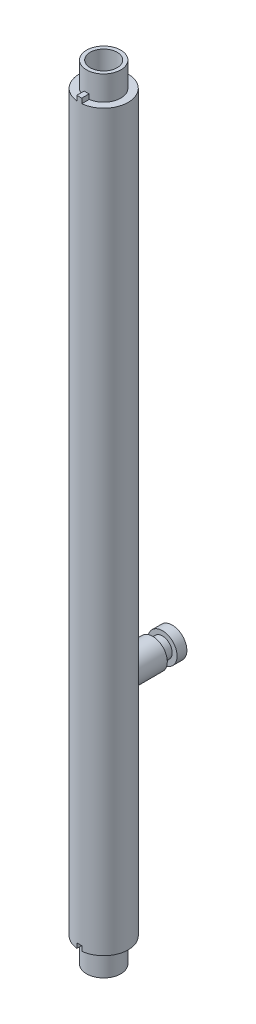
ISO-10303-21;
HEADER;
FILE_DESCRIPTION(('STEP AP214'),'2;1');
FILE_NAME('part.step','',(''),(''),'','','');
FILE_SCHEMA(('AUTOMOTIVE_DESIGN { 1 0 10303 214 1 1 1 1 }'));
ENDSEC;
DATA;
#1=APPLICATION_CONTEXT('core data for automotive mechanical design processes');
#2=APPLICATION_PROTOCOL_DEFINITION('international standard','automotive_design',2000,#1);
#3=PRODUCT_CONTEXT('',#1,'mechanical');
#4=PRODUCT('Part','Part','',(#3));
#5=PRODUCT_RELATED_PRODUCT_CATEGORY('part','',(#4));
#6=PRODUCT_DEFINITION_FORMATION('','',#4);
#7=PRODUCT_DEFINITION_CONTEXT('part definition',#1,'design');
#8=PRODUCT_DEFINITION('design','',#6,#7);
#9=PRODUCT_DEFINITION_SHAPE('','',#8);
#10=(LENGTH_UNIT() NAMED_UNIT(*) SI_UNIT(.MILLI.,.METRE.));
#11=(NAMED_UNIT(*) PLANE_ANGLE_UNIT() SI_UNIT($,.RADIAN.));
#12=(NAMED_UNIT(*) SI_UNIT($,.STERADIAN.) SOLID_ANGLE_UNIT());
#13=UNCERTAINTY_MEASURE_WITH_UNIT(LENGTH_MEASURE(1.E-05),#10,'distance_accuracy_value','');
#14=(GEOMETRIC_REPRESENTATION_CONTEXT(3) GLOBAL_UNCERTAINTY_ASSIGNED_CONTEXT((#13)) GLOBAL_UNIT_ASSIGNED_CONTEXT((#10,
#11,#12)) REPRESENTATION_CONTEXT('',''));
#15=CARTESIAN_POINT('',(0.,0.,0.));
#16=DIRECTION('',(0.,0.,1.));
#17=DIRECTION('',(1.,0.,0.));
#18=AXIS2_PLACEMENT_3D('',#15,#16,#17);
#19=CARTESIAN_POINT('',(0.,0.,-9.99999999999999));
#20=DIRECTION('',(0.,0.,1.));
#21=DIRECTION('',(1.,0.,0.));
#22=AXIS2_PLACEMENT_3D('',#19,#20,#21);
#23=PLANE('',#22);
#24=CARTESIAN_POINT('',(-1.07552855510562E-13,45.,-10.));
#25=DIRECTION('',(0.,0.,1.));
#26=DIRECTION('',(1.,0.,0.));
#27=AXIS2_PLACEMENT_3D('',#24,#25,#26);
#28=CIRCLE('',#27,3.);
#29=CARTESIAN_POINT('',(2.99999999999989,45.,-10.));
#30=VERTEX_POINT('',#29);
#31=EDGE_CURVE('E56',#30,#30,#28,.T.);
#32=ORIENTED_EDGE('',*,*,#31,.F.);
#33=EDGE_LOOP('',(#32));
#34=FACE_BOUND('',#33,.T.);
#35=DIRECTION('',(-1.,0.,0.));
#36=VECTOR('',#35,1.);
#37=CARTESIAN_POINT('',(5.00100000000001,45.4999999999999,-9.99999999999998));
#38=LINE('',#37,#36);
#39=CARTESIAN_POINT('',(-1.9541215409505,45.4999999999999,-9.99999999999999));
#40=VERTEX_POINT('',#39);
#41=CARTESIAN_POINT('',(-2.5,45.5,-9.99999999999997));
#42=VERTEX_POINT('',#41);
#43=EDGE_CURVE('E68',#40,#42,#38,.T.);
#44=ORIENTED_EDGE('',*,*,#43,.T.);
#45=DIRECTION('',(0.,-1.,0.));
#46=VECTOR('',#45,1.);
#47=CARTESIAN_POINT('',(-2.5,45.5,-10.));
#48=LINE('',#47,#46);
#49=CARTESIAN_POINT('',(-2.5,45.,-9.99999999999998));
#50=VERTEX_POINT('',#49);
#51=EDGE_CURVE('E73',#42,#50,#48,.T.);
#52=ORIENTED_EDGE('',*,*,#51,.T.);
#53=DIRECTION('',(-1.,0.,0.));
#54=VECTOR('',#53,1.);
#55=CARTESIAN_POINT('',(5.00100000000001,45.0000000000001,-9.99999999999999));
#56=LINE('',#55,#54);
#57=CARTESIAN_POINT('',(-1.99862761784134,44.9999999999999,-9.99999999999999));
#58=VERTEX_POINT('',#57);
#59=EDGE_CURVE('E218',#58,#50,#56,.T.);
#60=ORIENTED_EDGE('',*,*,#59,.F.);
#61=CARTESIAN_POINT('',(0.,45.0740786420086,-9.99999999999999));
#62=DIRECTION('',(0.,0.,-1.));
#63=DIRECTION('',(-1.,0.,0.));
#64=AXIS2_PLACEMENT_3D('',#61,#62,#63);
#65=CIRCLE('',#64,2.);
#66=EDGE_CURVE('E12',#40,#58,#65,.T.);
#67=ORIENTED_EDGE('',*,*,#66,.F.);
#68=EDGE_LOOP('',(#44,#52,#60,#67));
#69=FACE_BOUND('',#68,.T.);
#70=ADVANCED_FACE('F52',(#34,#69),#23,.F.);
#71=CARTESIAN_POINT('',(0.,45.0740786420084,-12.));
#72=DIRECTION('',(0.,0.,1.));
#73=DIRECTION('',(1.,0.,0.));
#74=AXIS2_PLACEMENT_3D('',#71,#72,#73);
#75=CYLINDRICAL_SURFACE('',#74,2.);
#76=DIRECTION('',(0.,0.,1.));
#77=VECTOR('',#76,1.);
#78=CARTESIAN_POINT('',(-1.95412154095047,45.4999999999999,-12.));
#79=LINE('',#78,#77);
#80=CARTESIAN_POINT('',(-1.95412154095047,45.4999999999999,-12.));
#81=VERTEX_POINT('',#80);
#82=EDGE_CURVE('E111',#81,#40,#79,.T.);
#83=ORIENTED_EDGE('',*,*,#82,.T.);
#84=ORIENTED_EDGE('',*,*,#66,.T.);
#85=DIRECTION('',(0.,0.,1.));
#86=VECTOR('',#85,1.);
#87=CARTESIAN_POINT('',(-1.99862761784135,44.9999999999999,-12.));
#88=LINE('',#87,#86);
#89=CARTESIAN_POINT('',(-1.99862761784135,44.9999999999999,-12.));
#90=VERTEX_POINT('',#89);
#91=EDGE_CURVE('E107',#58,#90,#88,.F.);
#92=ORIENTED_EDGE('',*,*,#91,.T.);
#93=CARTESIAN_POINT('',(0.,45.0740786420084,-12.));
#94=DIRECTION('',(0.,0.,-1.));
#95=DIRECTION('',(-1.,0.,0.));
#96=AXIS2_PLACEMENT_3D('',#93,#94,#95);
#97=CIRCLE('',#96,2.);
#98=EDGE_CURVE('E93',#81,#90,#97,.T.);
#99=ORIENTED_EDGE('',*,*,#98,.F.);
#100=EDGE_LOOP('',(#83,#84,#92,#99));
#101=FACE_BOUND('',#100,.T.);
#102=ADVANCED_FACE('F108',(#101),#75,.T.);
#103=CARTESIAN_POINT('',(0.,44.9999999999999,-12.));
#104=DIRECTION('',(0.,0.,-1.));
#105=DIRECTION('',(-1.,0.,0.));
#106=AXIS2_PLACEMENT_3D('',#103,#104,#105);
#107=PLANE('',#106);
#108=CARTESIAN_POINT('',(0.,44.9999999999999,-12.));
#109=DIRECTION('',(0.,0.,-1.));
#110=DIRECTION('',(-1.,0.,0.));
#111=AXIS2_PLACEMENT_3D('',#108,#109,#110);
#112=CIRCLE('',#111,3.);
#113=CARTESIAN_POINT('',(-3.00000000000005,44.9999999999999,-12.));
#114=VERTEX_POINT('',#113);
#115=EDGE_CURVE('E110',#114,#114,#112,.T.);
#116=ORIENTED_EDGE('',*,*,#115,.F.);
#117=EDGE_LOOP('',(#116));
#118=FACE_BOUND('',#117,.T.);
#119=DIRECTION('',(-1.,0.,0.));
#120=VECTOR('',#119,1.);
#121=CARTESIAN_POINT('',(5.00100000000001,45.4999999999999,-12.));
#122=LINE('',#121,#120);
#123=CARTESIAN_POINT('',(-2.5,45.4999999999999,-12.));
#124=VERTEX_POINT('',#123);
#125=EDGE_CURVE('E100',#81,#124,#122,.T.);
#126=ORIENTED_EDGE('',*,*,#125,.F.);
#127=ORIENTED_EDGE('',*,*,#98,.T.);
#128=DIRECTION('',(-1.,0.,0.));
#129=VECTOR('',#128,1.);
#130=CARTESIAN_POINT('',(5.00100000000001,44.9999999999999,-12.));
#131=LINE('',#130,#129);
#132=CARTESIAN_POINT('',(-2.5,44.9999999999999,-12.));
#133=VERTEX_POINT('',#132);
#134=EDGE_CURVE('E97',#90,#133,#131,.T.);
#135=ORIENTED_EDGE('',*,*,#134,.T.);
#136=DIRECTION('',(0.,1.,0.));
#137=VECTOR('',#136,1.);
#138=CARTESIAN_POINT('',(-2.5,44.9999999999999,-12.));
#139=LINE('',#138,#137);
#140=EDGE_CURVE('E211',#133,#124,#139,.T.);
#141=ORIENTED_EDGE('',*,*,#140,.T.);
#142=EDGE_LOOP('',(#126,#127,#135,#141));
#143=FACE_BOUND('',#142,.T.);
#144=ADVANCED_FACE('F95',(#118,#143),#107,.F.);
#145=CARTESIAN_POINT('',(-1.07552855510562E-13,45.,-10.));
#146=DIRECTION('',(0.,0.,1.));
#147=DIRECTION('',(1.,0.,0.));
#148=AXIS2_PLACEMENT_3D('',#145,#146,#147);
#149=CYLINDRICAL_SURFACE('',#148,3.);
#150=ORIENTED_EDGE('',*,*,#31,.T.);
#151=EDGE_LOOP('',(#150));
#152=FACE_BOUND('',#151,.T.);
#153=CARTESIAN_POINT('',(-3.00000000000009,44.9999999999999,-3.99999999999999));
#154=CARTESIAN_POINT('',(-2.99999990599248,44.9245383896343,-3.99999997094657));
#155=CARTESIAN_POINT('',(-2.9971466007451,44.8490800481742,-4.00214560778386));
#156=CARTESIAN_POINT('',(-2.98579602023841,44.698816420844,-4.01061905841261));
#157=CARTESIAN_POINT('',(-2.97729658251841,44.6240113963192,-4.01694847458099));
#158=CARTESIAN_POINT('',(-2.94350195877009,44.4014575991998,-4.04185988554314));
#159=CARTESIAN_POINT('',(-2.90991036792577,44.2555338369612,-4.06636523363866));
#160=CARTESIAN_POINT('',(-2.82286888064332,43.9738047061269,-4.12724466313278));
#161=CARTESIAN_POINT('',(-2.76956233581249,43.8379345902783,-4.16353284212727));
#162=CARTESIAN_POINT('',(-2.64505893939312,43.577132828574,-4.24371857831165));
#163=CARTESIAN_POINT('',(-2.57385675138363,43.4522044605218,-4.28761840405595));
#164=CARTESIAN_POINT('',(-2.40542341931063,43.2000986897546,-4.38457211439751));
#165=CARTESIAN_POINT('',(-2.30607419983956,43.0745139192542,-4.43808896832274));
#166=CARTESIAN_POINT('',(-2.08854542159215,42.840474643631,-4.54452303763809));
#167=CARTESIAN_POINT('',(-1.97035175093539,42.7320330985767,-4.5974397715576));
#168=CARTESIAN_POINT('',(-1.70284578042268,42.5237175312857,-4.70351798165431));
#169=CARTESIAN_POINT('',(-1.55155129309914,42.4260335863588,-4.7560886962505));
#170=CARTESIAN_POINT('',(-1.31132430439168,42.3002534914119,-4.8257056366947));
#171=CARTESIAN_POINT('',(-1.22900736782615,42.2617758845418,-4.84737661360988));
#172=CARTESIAN_POINT('',(-1.06047221299642,42.1922090351207,-4.8870100275605));
#173=CARTESIAN_POINT('',(-0.974256618946955,42.1611149082883,-4.90497491519086));
#174=CARTESIAN_POINT('',(-0.806968026671549,42.1093725375466,-4.9351119388654));
#175=CARTESIAN_POINT('',(-0.726184158740303,42.0880127284708,-4.94767216447127));
#176=CARTESIAN_POINT('',(-0.562666348744547,42.0520500386489,-4.96892323787743));
#177=CARTESIAN_POINT('',(-0.47993352052768,42.0374433923623,-4.97761624192488));
#178=CARTESIAN_POINT('',(-0.313244621267508,42.0152153154838,-4.99087754875313));
#179=CARTESIAN_POINT('',(-0.229289227265479,42.0075901576881,-4.99544805239183));
#180=CARTESIAN_POINT('',(-0.0609397888853135,41.9994333601527,-5.00033941607429));
#181=CARTESIAN_POINT('',(0.0234542099896544,41.9989009987063,-5.00066070848406));
#182=CARTESIAN_POINT('',(0.255171183646275,42.0072427822797,-4.99565270087354));
#183=CARTESIAN_POINT('',(0.402219957267106,42.023471149649,-4.98590479614142));
#184=CARTESIAN_POINT('',(0.690956248818397,42.0769554936823,-4.95416390550293));
#185=CARTESIAN_POINT('',(0.83264336913133,42.1142130266104,-4.93217001333341));
#186=CARTESIAN_POINT('',(1.10810607069189,42.2083322330019,-4.87769707511975));
#187=CARTESIAN_POINT('',(1.24183096722655,42.2653064201998,-4.84515792140775));
#188=CARTESIAN_POINT('',(1.49797933560345,42.3967689344516,-4.77219304045846));
#189=CARTESIAN_POINT('',(1.62039986081232,42.4712618101357,-4.73176526544935));
#190=CARTESIAN_POINT('',(1.86614789799236,42.6456782796184,-4.64075842839173));
#191=CARTESIAN_POINT('',(1.98783715480746,42.7475766485354,-4.58954363323803));
#192=CARTESIAN_POINT('',(2.21342948923165,42.9688082101048,-4.48511110796774));
#193=CARTESIAN_POINT('',(2.31730807434112,43.088164999719,-4.43189074054161));
#194=CARTESIAN_POINT('',(2.51649670159325,43.3573068203977,-4.32222149525339));
#195=CARTESIAN_POINT('',(2.60941864927579,43.5090151553296,-4.26611322583745));
#196=CARTESIAN_POINT('',(2.76794435835447,43.8294124610267,-4.1650175930069));
#197=CARTESIAN_POINT('',(2.83359844351376,43.9980694313142,-4.12000980621701));
#198=CARTESIAN_POINT('',(2.92154993808435,44.3047872644956,-4.05791730375361));
#199=CARTESIAN_POINT('',(2.95055806318475,44.4400812657923,-4.0366777727856));
#200=CARTESIAN_POINT('',(2.98961745817046,44.7147472194013,-4.00784301513237));
#201=CARTESIAN_POINT('',(2.99969077510549,44.8541142368845,-4.00023192044753));
#202=CARTESIAN_POINT('',(3.00029561322375,45.1331033689616,-3.99977828828379));
#203=CARTESIAN_POINT('',(2.99080006076181,45.2727255696017,-4.00695621149425));
#204=CARTESIAN_POINT('',(2.95280584471622,45.5479746723137,-4.03503040875296));
#205=CARTESIAN_POINT('',(2.9242921604511,45.6835983278198,-4.05593752603304));
#206=CARTESIAN_POINT('',(2.84976612867929,45.9474292155494,-4.10863539286049));
#207=CARTESIAN_POINT('',(2.80377564381482,46.0756454841374,-4.14041253958232));
#208=CARTESIAN_POINT('',(2.69592568264792,46.3229552203074,-4.21143069058874));
#209=CARTESIAN_POINT('',(2.63406022035172,46.4420452245938,-4.25067450889246));
#210=CARTESIAN_POINT('',(2.48334675803866,46.6904810952462,-4.34073681424693));
#211=CARTESIAN_POINT('',(2.39164503852695,46.8178054323293,-4.39236652981539));
#212=CARTESIAN_POINT('',(2.18975614095883,47.0565672039452,-4.49643335252963));
#213=CARTESIAN_POINT('',(2.0795512745713,47.1679892460943,-4.54887118822611));
#214=CARTESIAN_POINT('',(1.82651475528325,47.3864639913157,-4.65671991538653));
#215=CARTESIAN_POINT('',(1.68130397020027,47.4910647057627,-4.7116308034312));
#216=CARTESIAN_POINT('',(1.44944631278509,47.6281544977232,-4.7859945820211));
#217=CARTESIAN_POINT('',(1.3697860571165,47.6705620021367,-4.80945640676865));
#218=CARTESIAN_POINT('',(1.20623656162325,47.7483038834783,-4.85305400686525));
#219=CARTESIAN_POINT('',(1.12235002598576,47.7836427131186,-4.87319187464058));
#220=CARTESIAN_POINT('',(0.957140698774961,47.8444796432343,-4.9082066725368));
#221=CARTESIAN_POINT('',(0.876069467337989,47.8705037184617,-4.9233583127873));
#222=CARTESIAN_POINT('',(0.711460619981284,47.9156649816089,-4.94982497459132));
#223=CARTESIAN_POINT('',(0.627924414708809,47.9348060288798,-4.96114214594589));
#224=CARTESIAN_POINT('',(0.459119615082244,47.965900309713,-4.97959903931251));
#225=CARTESIAN_POINT('',(0.373852241304001,47.9778584373604,-4.98674160560364));
#226=CARTESIAN_POINT('',(0.202384159163418,47.9944067616589,-4.99664216975595));
#227=CARTESIAN_POINT('',(0.116183573945361,47.9989979187889,-4.99940073918633));
#228=CARTESIAN_POINT('',(-0.119519384080624,48.0013282897594,-5.00079353601933));
#229=CARTESIAN_POINT('',(-0.269213134971617,47.991601074574,-4.99493619757573));
#230=CARTESIAN_POINT('',(-0.564325544477563,47.9502179458509,-4.97026391444785));
#231=CARTESIAN_POINT('',(-0.709744155455477,47.9185617880598,-4.95144882543494));
#232=CARTESIAN_POINT('',(-0.990283617430285,47.8355594293537,-4.90298726022975));
#233=CARTESIAN_POINT('',(-1.12553205648683,47.7845365604509,-4.87351900635899));
#234=CARTESIAN_POINT('',(-1.38556595318157,47.6647190582364,-4.80606707983654));
#235=CARTESIAN_POINT('',(-1.51034905620301,47.5959204396563,-4.76808149787886));
#236=CARTESIAN_POINT('',(-1.76052652812021,47.4341500931041,-4.68186861678972));
#237=CARTESIAN_POINT('',(-1.88451663454105,47.3393649364718,-4.63297714592579));
#238=CARTESIAN_POINT('',(-2.11579577789699,47.1324915754344,-4.53203789358832));
#239=CARTESIAN_POINT('',(-2.22306604531473,47.0203842023355,-4.47998665474642));
#240=CARTESIAN_POINT('',(-2.43181699852653,46.7654389566212,-4.37056449731607));
#241=CARTESIAN_POINT('',(-2.53083841179825,46.6205069155108,-4.31335603990194));
#242=CARTESIAN_POINT('',(-2.70314606061135,46.3129904274046,-4.20752457767505));
#243=CARTESIAN_POINT('',(-2.77644567607677,46.1504152158019,-4.15889711577769));
#244=CARTESIAN_POINT('',(-2.86193484914589,45.9033774473123,-4.10004730463767));
#245=CARTESIAN_POINT('',(-2.88571236613343,45.8243414087027,-4.08329508678221));
#246=CARTESIAN_POINT('',(-2.92679381745562,45.6638695581997,-4.0539508765597));
#247=CARTESIAN_POINT('',(-2.94410184772367,45.5824353000126,-4.04135625254713));
#248=CARTESIAN_POINT('',(-2.97191221271444,45.4179534493059,-4.02094972226272));
#249=CARTESIAN_POINT('',(-2.98242533831525,45.3349086316282,-4.01313023377051));
#250=CARTESIAN_POINT('',(-2.99646884485449,45.1679077833363,-4.00265571377827));
#251=CARTESIAN_POINT('',(-3.00000010458457,45.0839518687375,-4.00000003232224));
#252=CARTESIAN_POINT('',(-3.00000000000009,44.9999999999999,-3.99999999999999));
#253=B_SPLINE_CURVE_WITH_KNOTS('',3,(#153,#154,#155,#156,#157,#158,#159,#160,#161,#162,#163,
#164,#165,#166,#167,#168,#169,#170,#171,#172,#173,#174,#175,#176,#177,#178,#179,#180,#181,#182,
#183,#184,#185,#186,#187,#188,#189,#190,#191,#192,#193,#194,#195,#196,#197,#198,#199,#200,#201,
#202,#203,#204,#205,#206,#207,#208,#209,#210,#211,#212,#213,#214,#215,#216,#217,#218,#219,#220,
#221,#222,#223,#224,#225,#226,#227,#228,#229,#230,#231,#232,#233,#234,#235,#236,#237,#238,#239,
#240,#241,#242,#243,#244,#245,#246,#247,#248,#249,#250,#251,#252),.UNSPECIFIED.,.T.,.F.,(4,2,2,
2,2,2,2,2,2,2,2,2,2,2,2,2,2,2,2,2,2,2,2,2,2,2,2,2,2,2,2,2,2,2,2,2,2,2,2,2,2,2,2,2,2,2,2,2,2,4),
(0.,0.226288173517902,0.45266306509115,0.905305714765944,1.35471981612581,1.804268090599,
2.30878181396806,2.81367513819688,3.37309572088446,3.65297634398312,3.93267130287329,
4.18580566749444,4.43879871451846,4.69165661737851,4.9444887912271,5.38694235003545,
5.82942865693076,6.27448283989933,6.71965270654931,7.21799594026834,7.71701907227955,
8.27387316194692,8.82969494223678,9.2478657002351,9.66554925202095,10.083811059365,
10.5024036052238,10.9204742264512,11.3387027222345,11.8323285087813,12.3264288987104,
12.884776299373,13.1641700331408,13.4433872125907,13.7024631857776,13.9613936663243,
14.2201475237758,14.4788676430947,14.9267946196282,15.3747265854331,15.8154875864153,
16.2563474905319,16.74506745363,17.2343321574793,17.7856420979723,18.3366648323363,
18.5890061072373,18.8411873492279,19.0929671157918,19.3447151893882),.UNSPECIFIED.);
#254=CARTESIAN_POINT('',(-3.00000000000009,44.9999999999999,-3.99999999999999));
#255=VERTEX_POINT('',#254);
#256=EDGE_CURVE('E103',#255,#255,#253,.T.);
#257=ORIENTED_EDGE('',*,*,#256,.F.);
#258=EDGE_LOOP('',(#257));
#259=FACE_BOUND('',#258,.T.);
#260=ADVANCED_FACE('F54',(#152,#259),#149,.T.);
#261=CARTESIAN_POINT('',(-1.00613961606655E-13,150.,0.));
#262=DIRECTION('',(0.,-1.,0.));
#263=DIRECTION('',(0.,0.,-1.));
#264=AXIS2_PLACEMENT_3D('',#261,#262,#263);
#265=CYLINDRICAL_SURFACE('',#264,5.);
#266=ORIENTED_EDGE('',*,*,#256,.T.);
#267=EDGE_LOOP('',(#266));
#268=FACE_BOUND('',#267,.T.);
#269=ADVANCED_FACE('F132',(#268),#265,.F.);
#270=CARTESIAN_POINT('',(0.,45.,-14.));
#271=DIRECTION('',(0.,0.,1.));
#272=DIRECTION('',(1.,0.,0.));
#273=AXIS2_PLACEMENT_3D('',#270,#271,#272);
#274=CYLINDRICAL_SURFACE('',#273,3.);
#275=CARTESIAN_POINT('',(0.,45.,-14.));
#276=DIRECTION('',(0.,0.,-1.));
#277=DIRECTION('',(-1.,0.,0.));
#278=AXIS2_PLACEMENT_3D('',#275,#276,#277);
#279=CIRCLE('',#278,3.);
#280=CARTESIAN_POINT('',(-3.,45.,-14.));
#281=VERTEX_POINT('',#280);
#282=EDGE_CURVE('E104',#281,#281,#279,.T.);
#283=ORIENTED_EDGE('',*,*,#282,.F.);
#284=EDGE_LOOP('',(#283));
#285=FACE_BOUND('',#284,.T.);
#286=ORIENTED_EDGE('',*,*,#115,.T.);
#287=EDGE_LOOP('',(#286));
#288=FACE_BOUND('',#287,.T.);
#289=ADVANCED_FACE('F136',(#285,#288),#274,.T.);
#290=CARTESIAN_POINT('',(0.,45.,-14.));
#291=DIRECTION('',(0.,0.,-1.));
#292=DIRECTION('',(-1.,0.,0.));
#293=AXIS2_PLACEMENT_3D('',#290,#291,#292);
#294=PLANE('',#293);
#295=ORIENTED_EDGE('',*,*,#282,.T.);
#296=EDGE_LOOP('',(#295));
#297=FACE_BOUND('',#296,.T.);
#298=ADVANCED_FACE('F142',(#297),#294,.T.);
#299=CARTESIAN_POINT('',(-2.5,0.,0.));
#300=DIRECTION('',(1.,0.,0.));
#301=DIRECTION('',(0.,0.,-0.999999999999999));
#302=AXIS2_PLACEMENT_3D('',#299,#300,#301);
#303=PLANE('',#302);
#304=DIRECTION('',(0.,0.,-0.999999999999999));
#305=VECTOR('',#304,1.);
#306=CARTESIAN_POINT('',(-2.5,45.,-10.));
#307=LINE('',#306,#305);
#308=EDGE_CURVE('E116',#50,#133,#307,.T.);
#309=ORIENTED_EDGE('',*,*,#308,.F.);
#310=ORIENTED_EDGE('',*,*,#51,.F.);
#311=DIRECTION('',(0.,0.,0.999999999999999));
#312=VECTOR('',#311,1.);
#313=CARTESIAN_POINT('',(-2.5,45.4999999999999,-12.));
#314=LINE('',#313,#312);
#315=EDGE_CURVE('E213',#124,#42,#314,.T.);
#316=ORIENTED_EDGE('',*,*,#315,.F.);
#317=ORIENTED_EDGE('',*,*,#140,.F.);
#318=EDGE_LOOP('',(#309,#310,#316,#317));
#319=FACE_BOUND('',#318,.T.);
#320=ADVANCED_FACE('F149',(#319),#303,.F.);
#321=CARTESIAN_POINT('',(5.00100000000001,45.4999999999999,-12.));
#322=DIRECTION('',(0.,-1.,0.));
#323=DIRECTION('',(0.,0.,-0.999999999999999));
#324=AXIS2_PLACEMENT_3D('',#321,#322,#323);
#325=PLANE('',#324);
#326=ORIENTED_EDGE('',*,*,#82,.F.);
#327=ORIENTED_EDGE('',*,*,#125,.T.);
#328=ORIENTED_EDGE('',*,*,#315,.T.);
#329=ORIENTED_EDGE('',*,*,#43,.F.);
#330=EDGE_LOOP('',(#326,#327,#328,#329));
#331=FACE_BOUND('',#330,.T.);
#332=ADVANCED_FACE('F153',(#331),#325,.F.);
#333=CARTESIAN_POINT('',(5.00100000000001,45.0000000000001,-9.99999999999999));
#334=DIRECTION('',(0.,1.,0.));
#335=DIRECTION('',(0.,0.,0.999999999999999));
#336=AXIS2_PLACEMENT_3D('',#333,#334,#335);
#337=PLANE('',#336);
#338=ORIENTED_EDGE('',*,*,#91,.F.);
#339=ORIENTED_EDGE('',*,*,#59,.T.);
#340=ORIENTED_EDGE('',*,*,#308,.T.);
#341=ORIENTED_EDGE('',*,*,#134,.F.);
#342=EDGE_LOOP('',(#338,#339,#340,#341));
#343=FACE_BOUND('',#342,.T.);
#344=ADVANCED_FACE('F114',(#343),#337,.F.);
#345=CLOSED_SHELL('',(#70,#102,#144,#260,#269,#289,#298,#320,#332,#344));
#346=MANIFOLD_SOLID_BREP('B2',#345);
#347=CARTESIAN_POINT('',(-1.00613961606655E-13,150.,0.));
#348=DIRECTION('',(0.,1.,0.));
#349=DIRECTION('',(0.,0.,1.));
#350=AXIS2_PLACEMENT_3D('',#347,#348,#349);
#351=PLANE('',#350);
#352=CARTESIAN_POINT('',(-1.00613961606655E-13,150.,0.));
#353=DIRECTION('',(0.,1.,0.));
#354=DIRECTION('',(0.,0.,1.));
#355=AXIS2_PLACEMENT_3D('',#352,#353,#354);
#356=CIRCLE('',#355,5.);
#357=CARTESIAN_POINT('',(0.500000000000011,150.,4.97493718553309));
#358=VERTEX_POINT('',#357);
#359=CARTESIAN_POINT('',(-0.499999999999992,150.,4.97493718553309));
#360=VERTEX_POINT('',#359);
#361=EDGE_CURVE('E355',#358,#360,#356,.T.);
#362=ORIENTED_EDGE('',*,*,#361,.T.);
#363=DIRECTION('',(0.,0.,0.999999999999999));
#364=VECTOR('',#363,1.);
#365=CARTESIAN_POINT('',(-0.49999999999999,150.,3.50000000000001));
#366=LINE('',#365,#364);
#367=CARTESIAN_POINT('',(-0.49999999999999,150.,3.46410161513776));
#368=VERTEX_POINT('',#367);
#369=EDGE_CURVE('E407',#368,#360,#366,.T.);
#370=ORIENTED_EDGE('',*,*,#369,.F.);
#371=CARTESIAN_POINT('',(-1.00613961606655E-13,150.,0.));
#372=DIRECTION('',(0.,1.,0.));
#373=DIRECTION('',(0.,0.,1.));
#374=AXIS2_PLACEMENT_3D('',#371,#372,#373);
#375=CIRCLE('',#374,3.5);
#376=CARTESIAN_POINT('',(0.500000000000013,150.,3.46410161513776));
#377=VERTEX_POINT('',#376);
#378=EDGE_CURVE('E232',#377,#368,#375,.T.);
#379=ORIENTED_EDGE('',*,*,#378,.F.);
#380=DIRECTION('',(0.,0.,-0.999999999999999));
#381=VECTOR('',#380,1.);
#382=CARTESIAN_POINT('',(0.500000000000009,150.,3.50000000000001));
#383=LINE('',#382,#381);
#384=EDGE_CURVE('E408',#358,#377,#383,.T.);
#385=ORIENTED_EDGE('',*,*,#384,.F.);
#386=EDGE_LOOP('',(#362,#370,#379,#385));
#387=FACE_BOUND('',#386,.T.);
#388=ADVANCED_FACE('F224',(#387),#351,.T.);
#389=CARTESIAN_POINT('',(0.,155.,0.));
#390=DIRECTION('',(0.,-1.,0.));
#391=DIRECTION('',(0.,0.,-1.));
#392=AXIS2_PLACEMENT_3D('',#389,#390,#391);
#393=CYLINDRICAL_SURFACE('',#392,3.5);
#394=CARTESIAN_POINT('',(0.,155.,0.));
#395=DIRECTION('',(0.,1.,0.));
#396=DIRECTION('',(0.,0.,1.));
#397=AXIS2_PLACEMENT_3D('',#394,#395,#396);
#398=CIRCLE('',#397,3.5);
#399=CARTESIAN_POINT('',(0.,155.,3.49999999999998));
#400=VERTEX_POINT('',#399);
#401=EDGE_CURVE('E344',#400,#400,#398,.T.);
#402=ORIENTED_EDGE('',*,*,#401,.F.);
#403=EDGE_LOOP('',(#402));
#404=FACE_BOUND('',#403,.T.);
#405=DIRECTION('',(0.,-1.,0.));
#406=VECTOR('',#405,1.);
#407=CARTESIAN_POINT('',(-0.49999999999999,151.,3.46410161513776));
#408=LINE('',#407,#406);
#409=CARTESIAN_POINT('',(-0.49999999999999,151.,3.46410161513776));
#410=VERTEX_POINT('',#409);
#411=EDGE_CURVE('E299',#410,#368,#408,.T.);
#412=ORIENTED_EDGE('',*,*,#411,.F.);
#413=CARTESIAN_POINT('',(0.,151.,0.));
#414=DIRECTION('',(0.,-1.,0.));
#415=DIRECTION('',(0.,0.,0.999999999999999));
#416=AXIS2_PLACEMENT_3D('',#413,#414,#415);
#417=CIRCLE('',#416,3.50000000000002);
#418=CARTESIAN_POINT('',(0.500000000000011,151.,3.46410161513772));
#419=VERTEX_POINT('',#418);
#420=EDGE_CURVE('E287',#419,#410,#417,.T.);
#421=ORIENTED_EDGE('',*,*,#420,.F.);
#422=DIRECTION('',(0.,-1.,0.));
#423=VECTOR('',#422,1.);
#424=CARTESIAN_POINT('',(0.500000000000013,151.,3.46410161513776));
#425=LINE('',#424,#423);
#426=EDGE_CURVE('E239',#419,#377,#425,.T.);
#427=ORIENTED_EDGE('',*,*,#426,.T.);
#428=ORIENTED_EDGE('',*,*,#378,.T.);
#429=EDGE_LOOP('',(#412,#421,#427,#428));
#430=FACE_BOUND('',#429,.T.);
#431=ADVANCED_FACE('F307',(#404,#430),#393,.T.);
#432=CARTESIAN_POINT('',(-1.00613961606655E-13,150.,0.));
#433=DIRECTION('',(0.,-1.,0.));
#434=DIRECTION('',(0.,0.,-1.));
#435=AXIS2_PLACEMENT_3D('',#432,#433,#434);
#436=CYLINDRICAL_SURFACE('',#435,5.);
#437=ORIENTED_EDGE('',*,*,#361,.F.);
#438=DIRECTION('',(0.,-1.,0.));
#439=VECTOR('',#438,1.);
#440=CARTESIAN_POINT('',(0.500000000000011,151.,4.97493718553309));
#441=LINE('',#440,#439);
#442=CARTESIAN_POINT('',(0.500000000000011,151.,4.97493718553309));
#443=VERTEX_POINT('',#442);
#444=EDGE_CURVE('E312',#443,#358,#441,.T.);
#445=ORIENTED_EDGE('',*,*,#444,.F.);
#446=CARTESIAN_POINT('',(0.,151.,0.));
#447=DIRECTION('',(0.,1.,0.));
#448=DIRECTION('',(0.,0.,0.999999999999999));
#449=AXIS2_PLACEMENT_3D('',#446,#447,#448);
#450=CIRCLE('',#449,5.);
#451=CARTESIAN_POINT('',(-0.49999999999999,151.,4.97493718553308));
#452=VERTEX_POINT('',#451);
#453=EDGE_CURVE('E304',#452,#443,#450,.T.);
#454=ORIENTED_EDGE('',*,*,#453,.F.);
#455=DIRECTION('',(0.,-1.,0.));
#456=VECTOR('',#455,1.);
#457=CARTESIAN_POINT('',(-0.49999999999999,151.,4.97493718553308));
#458=LINE('',#457,#456);
#459=EDGE_CURVE('E302',#452,#360,#458,.T.);
#460=ORIENTED_EDGE('',*,*,#459,.T.);
#461=EDGE_LOOP('',(#437,#445,#454,#460));
#462=FACE_BOUND('',#461,.T.);
#463=CARTESIAN_POINT('',(0.,0.99999999999989,0.));
#464=DIRECTION('',(0.,1.,0.));
#465=DIRECTION('',(0.,0.,1.));
#466=AXIS2_PLACEMENT_3D('',#463,#464,#465);
#467=CIRCLE('',#466,5.);
#468=CARTESIAN_POINT('',(-0.5,0.999999999999973,4.97493718553308));
#469=VERTEX_POINT('',#468);
#470=CARTESIAN_POINT('',(0.5,0.99999999999989,4.97493718553309));
#471=VERTEX_POINT('',#470);
#472=EDGE_CURVE('E50',#469,#471,#467,.T.);
#473=ORIENTED_EDGE('',*,*,#472,.T.);
#474=DIRECTION('',(0.,-1.,0.));
#475=VECTOR('',#474,1.);
#476=CARTESIAN_POINT('',(0.4999999999999,150.,4.97493718553308));
#477=LINE('',#476,#475);
#478=CARTESIAN_POINT('',(0.5,-1.11022302462516E-13,4.97493718553309));
#479=VERTEX_POINT('',#478);
#480=EDGE_CURVE('E332',#471,#479,#477,.T.);
#481=ORIENTED_EDGE('',*,*,#480,.T.);
#482=CARTESIAN_POINT('',(0.,0.,0.));
#483=DIRECTION('',(0.,1.,0.));
#484=DIRECTION('',(0.,0.,1.));
#485=AXIS2_PLACEMENT_3D('',#482,#483,#484);
#486=CIRCLE('',#485,5.);
#487=CARTESIAN_POINT('',(-0.5,0.,4.97493718553309));
#488=VERTEX_POINT('',#487);
#489=EDGE_CURVE('E352',#479,#488,#486,.T.);
#490=ORIENTED_EDGE('',*,*,#489,.T.);
#491=DIRECTION('',(0.,-1.,0.));
#492=VECTOR('',#491,1.);
#493=CARTESIAN_POINT('',(-0.500000000000073,150.,4.97493718553309));
#494=LINE('',#493,#492);
#495=EDGE_CURVE('E335',#488,#469,#494,.F.);
#496=ORIENTED_EDGE('',*,*,#495,.T.);
#497=EDGE_LOOP('',(#473,#481,#490,#496));
#498=FACE_BOUND('',#497,.T.);
#499=ADVANCED_FACE('F226',(#462,#498),#436,.T.);
#500=CARTESIAN_POINT('',(0.,0.,0.));
#501=DIRECTION('',(0.,1.,0.));
#502=DIRECTION('',(0.,0.,1.));
#503=AXIS2_PLACEMENT_3D('',#500,#501,#502);
#504=PLANE('',#503);
#505=CARTESIAN_POINT('',(0.,0.,0.));
#506=DIRECTION('',(0.,-1.,0.));
#507=DIRECTION('',(0.,0.,-1.));
#508=AXIS2_PLACEMENT_3D('',#505,#506,#507);
#509=CIRCLE('',#508,3.5);
#510=CARTESIAN_POINT('',(-0.500000000000111,0.,3.46410161513777));
#511=VERTEX_POINT('',#510);
#512=CARTESIAN_POINT('',(0.499999999999974,0.,3.46410161513776));
#513=VERTEX_POINT('',#512);
#514=EDGE_CURVE('E349',#511,#513,#509,.T.);
#515=ORIENTED_EDGE('',*,*,#514,.F.);
#516=DIRECTION('',(0.,0.,1.));
#517=VECTOR('',#516,1.);
#518=CARTESIAN_POINT('',(-0.5,0.,-14.001));
#519=LINE('',#518,#517);
#520=EDGE_CURVE('E247',#511,#488,#519,.T.);
#521=ORIENTED_EDGE('',*,*,#520,.T.);
#522=ORIENTED_EDGE('',*,*,#489,.F.);
#523=DIRECTION('',(0.,0.,1.));
#524=VECTOR('',#523,1.);
#525=CARTESIAN_POINT('',(0.5,0.,-14.001));
#526=LINE('',#525,#524);
#527=EDGE_CURVE('E330',#513,#479,#526,.T.);
#528=ORIENTED_EDGE('',*,*,#527,.F.);
#529=EDGE_LOOP('',(#515,#521,#522,#528));
#530=FACE_BOUND('',#529,.T.);
#531=ADVANCED_FACE('F364',(#530),#504,.F.);
#532=CARTESIAN_POINT('',(0.,-4.99999999999998,0.));
#533=DIRECTION('',(0.,1.,0.));
#534=DIRECTION('',(0.,0.,1.));
#535=AXIS2_PLACEMENT_3D('',#532,#533,#534);
#536=CYLINDRICAL_SURFACE('',#535,3.5);
#537=CARTESIAN_POINT('',(0.,-4.99999999999998,0.));
#538=DIRECTION('',(0.,-1.,0.));
#539=DIRECTION('',(0.,0.,-1.));
#540=AXIS2_PLACEMENT_3D('',#537,#538,#539);
#541=CIRCLE('',#540,3.5);
#542=CARTESIAN_POINT('',(0.,-4.99999999999998,-3.50000000000001));
#543=VERTEX_POINT('',#542);
#544=EDGE_CURVE('E347',#543,#543,#541,.T.);
#545=ORIENTED_EDGE('',*,*,#544,.F.);
#546=EDGE_LOOP('',(#545));
#547=FACE_BOUND('',#546,.T.);
#548=ORIENTED_EDGE('',*,*,#514,.T.);
#549=DIRECTION('',(0.,1.,0.));
#550=VECTOR('',#549,1.);
#551=CARTESIAN_POINT('',(0.5,-5.00000000000003,3.46410161513774));
#552=LINE('',#551,#550);
#553=CARTESIAN_POINT('',(0.500000000000004,0.99999999999989,3.46410161513774));
#554=VERTEX_POINT('',#553);
#555=EDGE_CURVE('E317',#513,#554,#552,.T.);
#556=ORIENTED_EDGE('',*,*,#555,.T.);
#557=CARTESIAN_POINT('',(0.,0.99999999999989,0.));
#558=DIRECTION('',(0.,1.,0.));
#559=DIRECTION('',(0.,0.,1.));
#560=AXIS2_PLACEMENT_3D('',#557,#558,#559);
#561=CIRCLE('',#560,3.5);
#562=CARTESIAN_POINT('',(-0.500000000000108,0.999999999999918,3.46410161513776));
#563=VERTEX_POINT('',#562);
#564=EDGE_CURVE('E323',#554,#563,#561,.F.);
#565=ORIENTED_EDGE('',*,*,#564,.T.);
#566=DIRECTION('',(0.,1.,0.));
#567=VECTOR('',#566,1.);
#568=CARTESIAN_POINT('',(-0.5,-5.00000000000006,3.46410161513773));
#569=LINE('',#568,#567);
#570=EDGE_CURVE('E310',#563,#511,#569,.F.);
#571=ORIENTED_EDGE('',*,*,#570,.T.);
#572=EDGE_LOOP('',(#548,#556,#565,#571));
#573=FACE_BOUND('',#572,.T.);
#574=ADVANCED_FACE('F366',(#547,#573),#536,.T.);
#575=CARTESIAN_POINT('',(0.,-4.99999999999998,0.));
#576=DIRECTION('',(0.,-1.,0.));
#577=DIRECTION('',(0.,0.,-1.));
#578=AXIS2_PLACEMENT_3D('',#575,#576,#577);
#579=PLANE('',#578);
#580=CARTESIAN_POINT('',(0.,-4.99999999999998,0.));
#581=DIRECTION('',(0.,-1.,0.));
#582=DIRECTION('',(0.,0.,-1.));
#583=AXIS2_PLACEMENT_3D('',#580,#581,#582);
#584=CIRCLE('',#583,2.75);
#585=CARTESIAN_POINT('',(0.,-4.99999999999998,-2.75000000000001));
#586=VERTEX_POINT('',#585);
#587=EDGE_CURVE('E341',#586,#586,#584,.T.);
#588=ORIENTED_EDGE('',*,*,#587,.F.);
#589=EDGE_LOOP('',(#588));
#590=FACE_BOUND('',#589,.T.);
#591=ORIENTED_EDGE('',*,*,#544,.T.);
#592=EDGE_LOOP('',(#591));
#593=FACE_BOUND('',#592,.T.);
#594=ADVANCED_FACE('F399',(#590,#593),#579,.T.);
#595=CARTESIAN_POINT('',(0.,155.,0.));
#596=DIRECTION('',(0.,1.,0.));
#597=DIRECTION('',(0.,0.,1.));
#598=AXIS2_PLACEMENT_3D('',#595,#596,#597);
#599=PLANE('',#598);
#600=CARTESIAN_POINT('',(0.,155.,0.));
#601=DIRECTION('',(0.,1.,0.));
#602=DIRECTION('',(0.,0.,1.));
#603=AXIS2_PLACEMENT_3D('',#600,#601,#602);
#604=CIRCLE('',#603,2.75);
#605=CARTESIAN_POINT('',(0.,155.,2.74999999999998));
#606=VERTEX_POINT('',#605);
#607=EDGE_CURVE('E338',#606,#606,#604,.T.);
#608=ORIENTED_EDGE('',*,*,#607,.F.);
#609=EDGE_LOOP('',(#608));
#610=FACE_BOUND('',#609,.T.);
#611=ORIENTED_EDGE('',*,*,#401,.T.);
#612=EDGE_LOOP('',(#611));
#613=FACE_BOUND('',#612,.T.);
#614=ADVANCED_FACE('F472',(#610,#613),#599,.T.);
#615=CARTESIAN_POINT('',(0.,-13.0000000000002,0.));
#616=DIRECTION('',(0.,1.,0.));
#617=DIRECTION('',(0.,0.,1.));
#618=AXIS2_PLACEMENT_3D('',#615,#616,#617);
#619=CYLINDRICAL_SURFACE('',#618,2.75);
#620=ORIENTED_EDGE('',*,*,#587,.T.);
#621=EDGE_LOOP('',(#620));
#622=FACE_BOUND('',#621,.T.);
#623=ORIENTED_EDGE('',*,*,#607,.T.);
#624=EDGE_LOOP('',(#623));
#625=FACE_BOUND('',#624,.T.);
#626=ADVANCED_FACE('F457',(#622,#625),#619,.F.);
#627=CARTESIAN_POINT('',(-0.5,1.00000000000003,-14.001));
#628=DIRECTION('',(0.,1.,0.));
#629=DIRECTION('',(0.,0.,1.));
#630=AXIS2_PLACEMENT_3D('',#627,#628,#629);
#631=PLANE('',#630);
#632=ORIENTED_EDGE('',*,*,#472,.F.);
#633=DIRECTION('',(0.,0.,1.));
#634=VECTOR('',#633,1.);
#635=CARTESIAN_POINT('',(-0.5,1.00000000000003,-14.001));
#636=LINE('',#635,#634);
#637=EDGE_CURVE('E321',#563,#469,#636,.T.);
#638=ORIENTED_EDGE('',*,*,#637,.F.);
#639=ORIENTED_EDGE('',*,*,#564,.F.);
#640=DIRECTION('',(0.,0.,1.));
#641=VECTOR('',#640,1.);
#642=CARTESIAN_POINT('',(0.5,0.999999999999862,-14.001));
#643=LINE('',#642,#641);
#644=EDGE_CURVE('E320',#554,#471,#643,.T.);
#645=ORIENTED_EDGE('',*,*,#644,.T.);
#646=EDGE_LOOP('',(#632,#638,#639,#645));
#647=FACE_BOUND('',#646,.T.);
#648=ADVANCED_FACE('F370',(#647),#631,.F.);
#649=CARTESIAN_POINT('',(-0.5,0.,-14.001));
#650=DIRECTION('',(-1.,0.,0.));
#651=DIRECTION('',(0.,0.,1.));
#652=AXIS2_PLACEMENT_3D('',#649,#650,#651);
#653=PLANE('',#652);
#654=ORIENTED_EDGE('',*,*,#520,.F.);
#655=ORIENTED_EDGE('',*,*,#570,.F.);
#656=ORIENTED_EDGE('',*,*,#637,.T.);
#657=ORIENTED_EDGE('',*,*,#495,.F.);
#658=EDGE_LOOP('',(#654,#655,#656,#657));
#659=FACE_BOUND('',#658,.T.);
#660=ADVANCED_FACE('F368',(#659),#653,.F.);
#661=CARTESIAN_POINT('',(0.5,0.999999999999862,-14.001));
#662=DIRECTION('',(1.,0.,0.));
#663=DIRECTION('',(0.,0.,-1.));
#664=AXIS2_PLACEMENT_3D('',#661,#662,#663);
#665=PLANE('',#664);
#666=ORIENTED_EDGE('',*,*,#644,.F.);
#667=ORIENTED_EDGE('',*,*,#555,.F.);
#668=ORIENTED_EDGE('',*,*,#527,.T.);
#669=ORIENTED_EDGE('',*,*,#480,.F.);
#670=EDGE_LOOP('',(#666,#667,#668,#669));
#671=FACE_BOUND('',#670,.T.);
#672=ADVANCED_FACE('F373',(#671),#665,.F.);
#673=CARTESIAN_POINT('',(-0.49999999999999,151.,3.50000000000002));
#674=DIRECTION('',(1.,0.,0.));
#675=DIRECTION('',(0.,0.,-0.999999999999999));
#676=AXIS2_PLACEMENT_3D('',#673,#674,#675);
#677=PLANE('',#676);
#678=ORIENTED_EDGE('',*,*,#369,.T.);
#679=ORIENTED_EDGE('',*,*,#459,.F.);
#680=DIRECTION('',(0.,0.,0.999999999999999));
#681=VECTOR('',#680,1.);
#682=CARTESIAN_POINT('',(-0.49999999999999,151.,3.50000000000002));
#683=LINE('',#682,#681);
#684=EDGE_CURVE('E291',#410,#452,#683,.T.);
#685=ORIENTED_EDGE('',*,*,#684,.F.);
#686=ORIENTED_EDGE('',*,*,#411,.T.);
#687=EDGE_LOOP('',(#678,#679,#685,#686));
#688=FACE_BOUND('',#687,.T.);
#689=ADVANCED_FACE('F298',(#688),#677,.F.);
#690=CARTESIAN_POINT('',(0.500000000000011,151.,3.50000000000002));
#691=DIRECTION('',(-1.,0.,0.));
#692=DIRECTION('',(0.,0.,0.999999999999999));
#693=AXIS2_PLACEMENT_3D('',#690,#691,#692);
#694=PLANE('',#693);
#695=ORIENTED_EDGE('',*,*,#384,.T.);
#696=ORIENTED_EDGE('',*,*,#426,.F.);
#697=DIRECTION('',(0.,0.,-0.999999999999999));
#698=VECTOR('',#697,1.);
#699=CARTESIAN_POINT('',(0.500000000000011,151.,3.50000000000002));
#700=LINE('',#699,#698);
#701=EDGE_CURVE('E293',#443,#419,#700,.T.);
#702=ORIENTED_EDGE('',*,*,#701,.F.);
#703=ORIENTED_EDGE('',*,*,#444,.T.);
#704=EDGE_LOOP('',(#695,#696,#702,#703));
#705=FACE_BOUND('',#704,.T.);
#706=ADVANCED_FACE('F380',(#705),#694,.F.);
#707=CARTESIAN_POINT('',(0.,151.,0.));
#708=DIRECTION('',(0.,1.,0.));
#709=DIRECTION('',(0.,0.,0.999999999999999));
#710=AXIS2_PLACEMENT_3D('',#707,#708,#709);
#711=PLANE('',#710);
#712=ORIENTED_EDGE('',*,*,#701,.T.);
#713=ORIENTED_EDGE('',*,*,#420,.T.);
#714=ORIENTED_EDGE('',*,*,#684,.T.);
#715=ORIENTED_EDGE('',*,*,#453,.T.);
#716=EDGE_LOOP('',(#712,#713,#714,#715));
#717=FACE_BOUND('',#716,.T.);
#718=ADVANCED_FACE('F289',(#717),#711,.T.);
#719=CLOSED_SHELL('',(#388,#431,#499,#531,#574,#594,#614,#626,#648,#660,#672,#689,#706,#718));
#720=MANIFOLD_SOLID_BREP('B6',#719);
#721=ADVANCED_BREP_SHAPE_REPRESENTATION('',(#18,#346,#720),#14);
#722=SHAPE_DEFINITION_REPRESENTATION(#9,#721);
ENDSEC;
END-ISO-10303-21;
